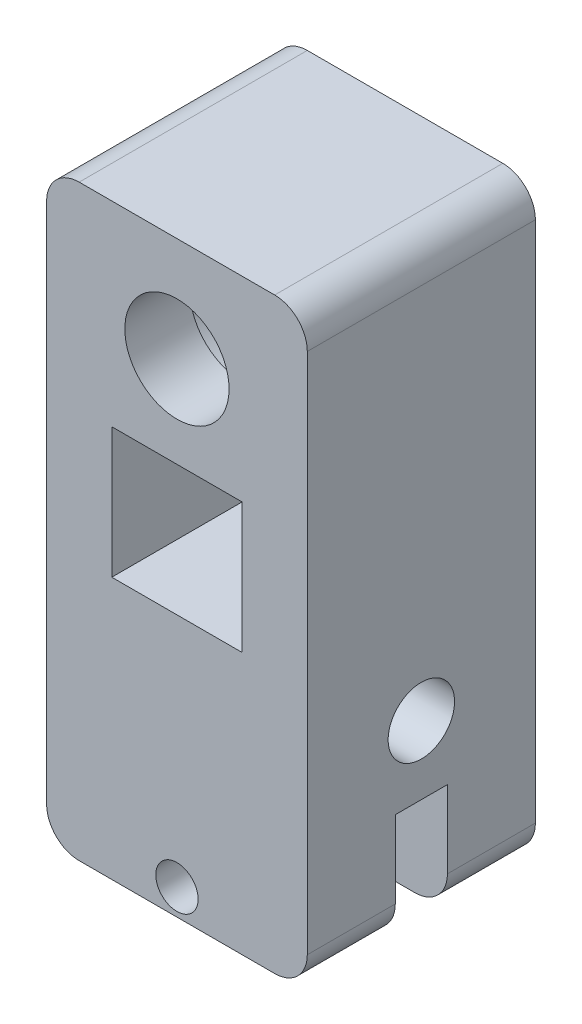
ISO-10303-21;
HEADER;
FILE_DESCRIPTION(('STEP AP214'),'2;1');
FILE_NAME('part.step','',(''),(''),'','','');
FILE_SCHEMA(('AUTOMOTIVE_DESIGN { 1 0 10303 214 1 1 1 1 }'));
ENDSEC;
DATA;
#1=APPLICATION_CONTEXT('core data for automotive mechanical design processes');
#2=APPLICATION_PROTOCOL_DEFINITION('international standard','automotive_design',2000,#1);
#3=PRODUCT_CONTEXT('',#1,'mechanical');
#4=PRODUCT('Part','Part','',(#3));
#5=PRODUCT_RELATED_PRODUCT_CATEGORY('part','',(#4));
#6=PRODUCT_DEFINITION_FORMATION('','',#4);
#7=PRODUCT_DEFINITION_CONTEXT('part definition',#1,'design');
#8=PRODUCT_DEFINITION('design','',#6,#7);
#9=PRODUCT_DEFINITION_SHAPE('','',#8);
#10=(LENGTH_UNIT() NAMED_UNIT(*) SI_UNIT(.MILLI.,.METRE.));
#11=(NAMED_UNIT(*) PLANE_ANGLE_UNIT() SI_UNIT($,.RADIAN.));
#12=(NAMED_UNIT(*) SI_UNIT($,.STERADIAN.) SOLID_ANGLE_UNIT());
#13=UNCERTAINTY_MEASURE_WITH_UNIT(LENGTH_MEASURE(1.E-05),#10,'distance_accuracy_value','');
#14=(GEOMETRIC_REPRESENTATION_CONTEXT(3) GLOBAL_UNCERTAINTY_ASSIGNED_CONTEXT((#13)) GLOBAL_UNIT_ASSIGNED_CONTEXT((#10,
#11,#12)) REPRESENTATION_CONTEXT('',''));
#15=CARTESIAN_POINT('',(0.,0.,0.));
#16=DIRECTION('',(0.,0.,1.));
#17=DIRECTION('',(1.,0.,0.));
#18=AXIS2_PLACEMENT_3D('',#15,#16,#17);
#19=CARTESIAN_POINT('',(5.,5.,35.));
#20=DIRECTION('',(0.,0.,-1.));
#21=DIRECTION('',(-1.,0.,0.));
#22=AXIS2_PLACEMENT_3D('',#19,#20,#21);
#23=CYLINDRICAL_SURFACE('',#22,5.);
#24=CARTESIAN_POINT('',(5.,5.,21.5));
#25=DIRECTION('',(0.,0.,1.));
#26=DIRECTION('',(1.,0.,0.));
#27=AXIS2_PLACEMENT_3D('',#24,#25,#26);
#28=CIRCLE('',#27,5.);
#29=CARTESIAN_POINT('',(5.00000000000004,0.,21.5));
#30=VERTEX_POINT('',#29);
#31=CARTESIAN_POINT('',(0.,5.,21.5));
#32=VERTEX_POINT('',#31);
#33=EDGE_CURVE('E283',#30,#32,#28,.F.);
#34=ORIENTED_EDGE('',*,*,#33,.F.);
#35=DIRECTION('',(0.,0.,-1.));
#36=VECTOR('',#35,1.);
#37=CARTESIAN_POINT('',(5.00000000000004,0.,35.));
#38=LINE('',#37,#36);
#39=CARTESIAN_POINT('',(5.00000000000004,0.,35.));
#40=VERTEX_POINT('',#39);
#41=EDGE_CURVE('E230',#40,#30,#38,.T.);
#42=ORIENTED_EDGE('',*,*,#41,.F.);
#43=CARTESIAN_POINT('',(5.,5.,35.));
#44=DIRECTION('',(0.,0.,1.));
#45=DIRECTION('',(1.,0.,0.));
#46=AXIS2_PLACEMENT_3D('',#43,#44,#45);
#47=CIRCLE('',#46,5.);
#48=CARTESIAN_POINT('',(0.,5.00000000000004,35.));
#49=VERTEX_POINT('',#48);
#50=EDGE_CURVE('E306',#40,#49,#47,.F.);
#51=ORIENTED_EDGE('',*,*,#50,.T.);
#52=DIRECTION('',(0.,0.,-1.));
#53=VECTOR('',#52,1.);
#54=CARTESIAN_POINT('',(0.,5.00000000000004,35.));
#55=LINE('',#54,#53);
#56=EDGE_CURVE('E48',#49,#32,#55,.T.);
#57=ORIENTED_EDGE('',*,*,#56,.T.);
#58=EDGE_LOOP('',(#34,#42,#51,#57));
#59=FACE_BOUND('',#58,.T.);
#60=ADVANCED_FACE('F39',(#59),#23,.T.);
#61=CARTESIAN_POINT('',(0.,0.,35.));
#62=DIRECTION('',(0.,1.,0.));
#63=DIRECTION('',(0.,0.,1.));
#64=AXIS2_PLACEMENT_3D('',#61,#62,#63);
#65=PLANE('',#64);
#66=ORIENTED_EDGE('',*,*,#41,.T.);
#67=DIRECTION('',(-1.,0.,0.));
#68=VECTOR('',#67,1.);
#69=CARTESIAN_POINT('',(40.,0.,21.5));
#70=LINE('',#69,#68);
#71=CARTESIAN_POINT('',(35.,0.,21.5));
#72=VERTEX_POINT('',#71);
#73=EDGE_CURVE('E245',#72,#30,#70,.T.);
#74=ORIENTED_EDGE('',*,*,#73,.F.);
#75=DIRECTION('',(0.,0.,-1.));
#76=VECTOR('',#75,1.);
#77=CARTESIAN_POINT('',(35.,0.,35.));
#78=LINE('',#77,#76);
#79=CARTESIAN_POINT('',(35.,0.,35.));
#80=VERTEX_POINT('',#79);
#81=EDGE_CURVE('E226',#80,#72,#78,.T.);
#82=ORIENTED_EDGE('',*,*,#81,.F.);
#83=DIRECTION('',(1.,0.,0.));
#84=VECTOR('',#83,1.);
#85=CARTESIAN_POINT('',(0.,0.,35.));
#86=LINE('',#85,#84);
#87=EDGE_CURVE('E309',#40,#80,#86,.T.);
#88=ORIENTED_EDGE('',*,*,#87,.F.);
#89=EDGE_LOOP('',(#66,#74,#82,#88));
#90=FACE_BOUND('',#89,.T.);
#91=ADVANCED_FACE('F315',(#90),#65,.F.);
#92=CARTESIAN_POINT('',(35.,5.,35.));
#93=DIRECTION('',(0.,0.,-1.));
#94=DIRECTION('',(-1.,0.,0.));
#95=AXIS2_PLACEMENT_3D('',#92,#93,#94);
#96=CYLINDRICAL_SURFACE('',#95,5.);
#97=ORIENTED_EDGE('',*,*,#81,.T.);
#98=CARTESIAN_POINT('',(35.,5.,21.5));
#99=DIRECTION('',(0.,0.,1.));
#100=DIRECTION('',(1.,0.,0.));
#101=AXIS2_PLACEMENT_3D('',#98,#99,#100);
#102=CIRCLE('',#101,5.);
#103=CARTESIAN_POINT('',(40.,5.00000000000004,21.5));
#104=VERTEX_POINT('',#103);
#105=EDGE_CURVE('E280',#72,#104,#102,.T.);
#106=ORIENTED_EDGE('',*,*,#105,.T.);
#107=DIRECTION('',(0.,0.,-1.));
#108=VECTOR('',#107,1.);
#109=CARTESIAN_POINT('',(40.,5.00000000000004,35.));
#110=LINE('',#109,#108);
#111=CARTESIAN_POINT('',(40.,5.00000000000004,35.));
#112=VERTEX_POINT('',#111);
#113=EDGE_CURVE('E223',#112,#104,#110,.T.);
#114=ORIENTED_EDGE('',*,*,#113,.F.);
#115=CARTESIAN_POINT('',(35.,5.,35.));
#116=DIRECTION('',(0.,0.,1.));
#117=DIRECTION('',(1.,0.,0.));
#118=AXIS2_PLACEMENT_3D('',#115,#116,#117);
#119=CIRCLE('',#118,5.);
#120=EDGE_CURVE('E155',#80,#112,#119,.T.);
#121=ORIENTED_EDGE('',*,*,#120,.F.);
#122=EDGE_LOOP('',(#97,#106,#114,#121));
#123=FACE_BOUND('',#122,.T.);
#124=ADVANCED_FACE('F318',(#123),#96,.T.);
#125=CARTESIAN_POINT('',(20.,4.,35.));
#126=DIRECTION('',(0.,0.,-1.));
#127=DIRECTION('',(-1.,0.,0.));
#128=AXIS2_PLACEMENT_3D('',#125,#126,#127);
#129=CYLINDRICAL_SURFACE('',#128,3.25);
#130=CARTESIAN_POINT('',(20.,4.,21.5));
#131=DIRECTION('',(0.,0.,1.));
#132=DIRECTION('',(1.,0.,0.));
#133=AXIS2_PLACEMENT_3D('',#130,#131,#132);
#134=CIRCLE('',#133,3.25);
#135=CARTESIAN_POINT('',(23.25,4.,21.5));
#136=VERTEX_POINT('',#135);
#137=EDGE_CURVE('E43',#136,#136,#134,.T.);
#138=ORIENTED_EDGE('',*,*,#137,.F.);
#139=EDGE_LOOP('',(#138));
#140=FACE_BOUND('',#139,.T.);
#141=CARTESIAN_POINT('',(20.,4.,35.));
#142=DIRECTION('',(0.,0.,1.));
#143=DIRECTION('',(1.,0.,0.));
#144=AXIS2_PLACEMENT_3D('',#141,#142,#143);
#145=CIRCLE('',#144,3.25);
#146=CARTESIAN_POINT('',(23.25,4.,35.));
#147=VERTEX_POINT('',#146);
#148=EDGE_CURVE('E175',#147,#147,#145,.T.);
#149=ORIENTED_EDGE('',*,*,#148,.T.);
#150=EDGE_LOOP('',(#149));
#151=FACE_BOUND('',#150,.T.);
#152=ADVANCED_FACE('F390',(#140,#151),#129,.F.);
#153=CARTESIAN_POINT('',(20.,74.17,35.));
#154=DIRECTION('',(0.,0.,-1.));
#155=DIRECTION('',(-1.,0.,0.));
#156=AXIS2_PLACEMENT_3D('',#153,#154,#155);
#157=CYLINDRICAL_SURFACE('',#156,12.);
#158=CARTESIAN_POINT('',(20.,74.17,0.));
#159=DIRECTION('',(0.,0.,1.));
#160=DIRECTION('',(1.,0.,0.));
#161=AXIS2_PLACEMENT_3D('',#158,#159,#160);
#162=CIRCLE('',#161,12.);
#163=CARTESIAN_POINT('',(32.,74.17,0.));
#164=VERTEX_POINT('',#163);
#165=EDGE_CURVE('E214',#164,#164,#162,.T.);
#166=ORIENTED_EDGE('',*,*,#165,.F.);
#167=EDGE_LOOP('',(#166));
#168=FACE_BOUND('',#167,.T.);
#169=CARTESIAN_POINT('',(20.,74.17,25.));
#170=DIRECTION('',(0.,0.,1.));
#171=DIRECTION('',(1.,0.,0.));
#172=AXIS2_PLACEMENT_3D('',#169,#170,#171);
#173=CIRCLE('',#172,12.);
#174=CARTESIAN_POINT('',(32.,74.17,25.));
#175=VERTEX_POINT('',#174);
#176=EDGE_CURVE('E186',#175,#175,#173,.T.);
#177=ORIENTED_EDGE('',*,*,#176,.T.);
#178=EDGE_LOOP('',(#177));
#179=FACE_BOUND('',#178,.T.);
#180=ADVANCED_FACE('F406',(#168,#179),#157,.F.);
#181=CARTESIAN_POINT('',(5.,85.17,35.));
#182=DIRECTION('',(0.,0.,-1.));
#183=DIRECTION('',(-1.,0.,0.));
#184=AXIS2_PLACEMENT_3D('',#181,#182,#183);
#185=CYLINDRICAL_SURFACE('',#184,5.);
#186=CARTESIAN_POINT('',(5.,85.17,0.));
#187=DIRECTION('',(0.,0.,1.));
#188=DIRECTION('',(1.,0.,0.));
#189=AXIS2_PLACEMENT_3D('',#186,#187,#188);
#190=CIRCLE('',#189,5.);
#191=CARTESIAN_POINT('',(0.,85.17,0.));
#192=VERTEX_POINT('',#191);
#193=CARTESIAN_POINT('',(5.,90.17,0.));
#194=VERTEX_POINT('',#193);
#195=EDGE_CURVE('E194',#192,#194,#190,.F.);
#196=ORIENTED_EDGE('',*,*,#195,.F.);
#197=DIRECTION('',(0.,0.,-1.));
#198=VECTOR('',#197,1.);
#199=CARTESIAN_POINT('',(0.,85.17,35.));
#200=LINE('',#199,#198);
#201=CARTESIAN_POINT('',(0.,85.17,35.));
#202=VERTEX_POINT('',#201);
#203=EDGE_CURVE('E11',#202,#192,#200,.T.);
#204=ORIENTED_EDGE('',*,*,#203,.F.);
#205=CARTESIAN_POINT('',(5.,85.17,35.));
#206=DIRECTION('',(0.,0.,1.));
#207=DIRECTION('',(1.,0.,0.));
#208=AXIS2_PLACEMENT_3D('',#205,#206,#207);
#209=CIRCLE('',#208,5.);
#210=CARTESIAN_POINT('',(5.,90.17,35.));
#211=VERTEX_POINT('',#210);
#212=EDGE_CURVE('E301',#202,#211,#209,.F.);
#213=ORIENTED_EDGE('',*,*,#212,.T.);
#214=DIRECTION('',(0.,0.,-1.));
#215=VECTOR('',#214,1.);
#216=CARTESIAN_POINT('',(5.,90.17,35.));
#217=LINE('',#216,#215);
#218=EDGE_CURVE('E65',#211,#194,#217,.T.);
#219=ORIENTED_EDGE('',*,*,#218,.T.);
#220=EDGE_LOOP('',(#196,#204,#213,#219));
#221=FACE_BOUND('',#220,.T.);
#222=ADVANCED_FACE('F402',(#221),#185,.T.);
#223=CARTESIAN_POINT('',(0.,0.,35.));
#224=DIRECTION('',(-1.,0.,0.));
#225=DIRECTION('',(0.,0.,1.));
#226=AXIS2_PLACEMENT_3D('',#223,#224,#225);
#227=PLANE('',#226);
#228=DIRECTION('',(0.,1.,0.));
#229=VECTOR('',#228,1.);
#230=CARTESIAN_POINT('',(0.,0.,21.5));
#231=LINE('',#230,#229);
#232=CARTESIAN_POINT('',(0.,16.86,21.5));
#233=VERTEX_POINT('',#232);
#234=EDGE_CURVE('E274',#32,#233,#231,.T.);
#235=ORIENTED_EDGE('',*,*,#234,.F.);
#236=ORIENTED_EDGE('',*,*,#56,.F.);
#237=DIRECTION('',(0.,1.,0.));
#238=VECTOR('',#237,1.);
#239=CARTESIAN_POINT('',(0.,0.,35.));
#240=LINE('',#239,#238);
#241=EDGE_CURVE('E303',#49,#202,#240,.T.);
#242=ORIENTED_EDGE('',*,*,#241,.T.);
#243=ORIENTED_EDGE('',*,*,#203,.T.);
#244=DIRECTION('',(0.,1.,0.));
#245=VECTOR('',#244,1.);
#246=CARTESIAN_POINT('',(0.,0.,0.));
#247=LINE('',#246,#245);
#248=CARTESIAN_POINT('',(0.,5.00000000000004,0.));
#249=VERTEX_POINT('',#248);
#250=EDGE_CURVE('E196',#249,#192,#247,.T.);
#251=ORIENTED_EDGE('',*,*,#250,.F.);
#252=CARTESIAN_POINT('',(0.,5.,13.5));
#253=VERTEX_POINT('',#252);
#254=EDGE_CURVE('E233',#253,#249,#55,.T.);
#255=ORIENTED_EDGE('',*,*,#254,.F.);
#256=DIRECTION('',(0.,-1.,0.));
#257=VECTOR('',#256,1.);
#258=CARTESIAN_POINT('',(0.,0.,13.5));
#259=LINE('',#258,#257);
#260=CARTESIAN_POINT('',(0.,16.86,13.5));
#261=VERTEX_POINT('',#260);
#262=EDGE_CURVE('E264',#261,#253,#259,.T.);
#263=ORIENTED_EDGE('',*,*,#262,.F.);
#264=DIRECTION('',(0.,0.,-1.));
#265=VECTOR('',#264,1.);
#266=CARTESIAN_POINT('',(0.,16.86,13.5));
#267=LINE('',#266,#265);
#268=EDGE_CURVE('E355',#233,#261,#267,.T.);
#269=ORIENTED_EDGE('',*,*,#268,.F.);
#270=EDGE_LOOP('',(#235,#236,#242,#243,#251,#255,#263,#269));
#271=FACE_BOUND('',#270,.T.);
#272=CARTESIAN_POINT('',(0.,27.36,17.5));
#273=DIRECTION('',(-1.,0.,0.));
#274=DIRECTION('',(0.,0.,1.));
#275=AXIS2_PLACEMENT_3D('',#272,#273,#274);
#276=CIRCLE('',#275,5.1);
#277=CARTESIAN_POINT('',(0.,27.36,22.6));
#278=VERTEX_POINT('',#277);
#279=EDGE_CURVE('E275',#278,#278,#276,.T.);
#280=ORIENTED_EDGE('',*,*,#279,.F.);
#281=EDGE_LOOP('',(#280));
#282=FACE_BOUND('',#281,.T.);
#283=ADVANCED_FACE('F361',(#271,#282),#227,.T.);
#284=CARTESIAN_POINT('',(5.,5.,13.5));
#285=DIRECTION('',(0.,0.,-1.));
#286=DIRECTION('',(0.,1.,0.));
#287=AXIS2_PLACEMENT_3D('',#284,#285,#286);
#288=CIRCLE('',#287,5.);
#289=CARTESIAN_POINT('',(5.00000000000004,0.,13.5));
#290=VERTEX_POINT('',#289);
#291=EDGE_CURVE('E249',#253,#290,#288,.F.);
#292=ORIENTED_EDGE('',*,*,#291,.F.);
#293=ORIENTED_EDGE('',*,*,#254,.T.);
#294=CARTESIAN_POINT('',(5.,5.,0.));
#295=DIRECTION('',(0.,0.,1.));
#296=DIRECTION('',(1.,0.,0.));
#297=AXIS2_PLACEMENT_3D('',#294,#295,#296);
#298=CIRCLE('',#297,5.);
#299=CARTESIAN_POINT('',(5.00000000000004,0.,0.));
#300=VERTEX_POINT('',#299);
#301=EDGE_CURVE('E199',#300,#249,#298,.F.);
#302=ORIENTED_EDGE('',*,*,#301,.F.);
#303=EDGE_CURVE('E229',#290,#300,#38,.T.);
#304=ORIENTED_EDGE('',*,*,#303,.F.);
#305=EDGE_LOOP('',(#292,#293,#302,#304));
#306=FACE_BOUND('',#305,.T.);
#307=ADVANCED_FACE('F368',(#306),#23,.T.);
#308=CARTESIAN_POINT('',(35.,0.,13.5));
#309=VERTEX_POINT('',#308);
#310=CARTESIAN_POINT('',(35.,0.,0.));
#311=VERTEX_POINT('',#310);
#312=EDGE_CURVE('E225',#309,#311,#78,.T.);
#313=ORIENTED_EDGE('',*,*,#312,.F.);
#314=DIRECTION('',(-1.,0.,0.));
#315=VECTOR('',#314,1.);
#316=CARTESIAN_POINT('',(40.,0.,13.5));
#317=LINE('',#316,#315);
#318=EDGE_CURVE('E252',#309,#290,#317,.T.);
#319=ORIENTED_EDGE('',*,*,#318,.T.);
#320=ORIENTED_EDGE('',*,*,#303,.T.);
#321=DIRECTION('',(1.,0.,0.));
#322=VECTOR('',#321,1.);
#323=CARTESIAN_POINT('',(0.,0.,0.));
#324=LINE('',#323,#322);
#325=EDGE_CURVE('E202',#300,#311,#324,.T.);
#326=ORIENTED_EDGE('',*,*,#325,.T.);
#327=EDGE_LOOP('',(#313,#319,#320,#326));
#328=FACE_BOUND('',#327,.T.);
#329=ADVANCED_FACE('F373',(#328),#65,.F.);
#330=CARTESIAN_POINT('',(40.,5.00000000000004,13.5));
#331=VERTEX_POINT('',#330);
#332=CARTESIAN_POINT('',(40.,5.00000000000004,0.));
#333=VERTEX_POINT('',#332);
#334=EDGE_CURVE('E169',#331,#333,#110,.T.);
#335=ORIENTED_EDGE('',*,*,#334,.F.);
#336=CARTESIAN_POINT('',(35.,5.,13.5));
#337=DIRECTION('',(0.,0.,-1.));
#338=DIRECTION('',(0.,1.,0.));
#339=AXIS2_PLACEMENT_3D('',#336,#337,#338);
#340=CIRCLE('',#339,5.);
#341=EDGE_CURVE('E244',#331,#309,#340,.T.);
#342=ORIENTED_EDGE('',*,*,#341,.T.);
#343=ORIENTED_EDGE('',*,*,#312,.T.);
#344=CARTESIAN_POINT('',(35.,5.,0.));
#345=DIRECTION('',(0.,0.,1.));
#346=DIRECTION('',(1.,0.,0.));
#347=AXIS2_PLACEMENT_3D('',#344,#345,#346);
#348=CIRCLE('',#347,5.);
#349=EDGE_CURVE('E205',#311,#333,#348,.T.);
#350=ORIENTED_EDGE('',*,*,#349,.T.);
#351=EDGE_LOOP('',(#335,#342,#343,#350));
#352=FACE_BOUND('',#351,.T.);
#353=ADVANCED_FACE('F380',(#352),#96,.T.);
#354=CARTESIAN_POINT('',(40.,0.,35.));
#355=DIRECTION('',(-1.,0.,0.));
#356=DIRECTION('',(0.,0.,1.));
#357=AXIS2_PLACEMENT_3D('',#354,#355,#356);
#358=PLANE('',#357);
#359=ORIENTED_EDGE('',*,*,#113,.T.);
#360=DIRECTION('',(0.,1.,0.));
#361=VECTOR('',#360,1.);
#362=CARTESIAN_POINT('',(40.,0.,21.5));
#363=LINE('',#362,#361);
#364=CARTESIAN_POINT('',(40.,16.86,21.5));
#365=VERTEX_POINT('',#364);
#366=EDGE_CURVE('E345',#104,#365,#363,.T.);
#367=ORIENTED_EDGE('',*,*,#366,.T.);
#368=DIRECTION('',(0.,0.,-1.));
#369=VECTOR('',#368,1.);
#370=CARTESIAN_POINT('',(40.,16.86,13.5));
#371=LINE('',#370,#369);
#372=CARTESIAN_POINT('',(40.,16.86,13.5));
#373=VERTEX_POINT('',#372);
#374=EDGE_CURVE('E351',#365,#373,#371,.T.);
#375=ORIENTED_EDGE('',*,*,#374,.T.);
#376=DIRECTION('',(0.,-1.,0.));
#377=VECTOR('',#376,1.);
#378=CARTESIAN_POINT('',(40.,0.,13.5));
#379=LINE('',#378,#377);
#380=EDGE_CURVE('E56',#373,#331,#379,.T.);
#381=ORIENTED_EDGE('',*,*,#380,.T.);
#382=ORIENTED_EDGE('',*,*,#334,.T.);
#383=DIRECTION('',(0.,1.,0.));
#384=VECTOR('',#383,1.);
#385=CARTESIAN_POINT('',(40.,0.,0.));
#386=LINE('',#385,#384);
#387=CARTESIAN_POINT('',(40.,85.17,0.));
#388=VERTEX_POINT('',#387);
#389=EDGE_CURVE('E165',#333,#388,#386,.T.);
#390=ORIENTED_EDGE('',*,*,#389,.T.);
#391=DIRECTION('',(0.,0.,-1.));
#392=VECTOR('',#391,1.);
#393=CARTESIAN_POINT('',(40.,85.17,35.));
#394=LINE('',#393,#392);
#395=CARTESIAN_POINT('',(40.,85.17,35.));
#396=VERTEX_POINT('',#395);
#397=EDGE_CURVE('E161',#396,#388,#394,.T.);
#398=ORIENTED_EDGE('',*,*,#397,.F.);
#399=DIRECTION('',(0.,1.,0.));
#400=VECTOR('',#399,1.);
#401=CARTESIAN_POINT('',(40.,0.,35.));
#402=LINE('',#401,#400);
#403=EDGE_CURVE('E146',#112,#396,#402,.T.);
#404=ORIENTED_EDGE('',*,*,#403,.F.);
#405=EDGE_LOOP('',(#359,#367,#375,#381,#382,#390,#398,#404));
#406=FACE_BOUND('',#405,.T.);
#407=CARTESIAN_POINT('',(40.,27.36,17.5));
#408=DIRECTION('',(-1.,0.,0.));
#409=DIRECTION('',(0.,0.,1.));
#410=AXIS2_PLACEMENT_3D('',#407,#408,#409);
#411=CIRCLE('',#410,5.1);
#412=CARTESIAN_POINT('',(40.,27.36,22.6));
#413=VERTEX_POINT('',#412);
#414=EDGE_CURVE('E271',#413,#413,#411,.T.);
#415=ORIENTED_EDGE('',*,*,#414,.T.);
#416=EDGE_LOOP('',(#415));
#417=FACE_BOUND('',#416,.T.);
#418=ADVANCED_FACE('F162',(#406,#417),#358,.F.);
#419=CARTESIAN_POINT('',(35.,85.17,35.));
#420=DIRECTION('',(0.,0.,-1.));
#421=DIRECTION('',(-1.,0.,0.));
#422=AXIS2_PLACEMENT_3D('',#419,#420,#421);
#423=CYLINDRICAL_SURFACE('',#422,5.);
#424=CARTESIAN_POINT('',(35.,85.17,0.));
#425=DIRECTION('',(0.,0.,1.));
#426=DIRECTION('',(1.,0.,0.));
#427=AXIS2_PLACEMENT_3D('',#424,#425,#426);
#428=CIRCLE('',#427,5.);
#429=CARTESIAN_POINT('',(35.,90.17,0.));
#430=VERTEX_POINT('',#429);
#431=EDGE_CURVE('E209',#430,#388,#428,.F.);
#432=ORIENTED_EDGE('',*,*,#431,.F.);
#433=DIRECTION('',(0.,0.,-1.));
#434=VECTOR('',#433,1.);
#435=CARTESIAN_POINT('',(35.,90.17,35.));
#436=LINE('',#435,#434);
#437=CARTESIAN_POINT('',(35.,90.17,35.));
#438=VERTEX_POINT('',#437);
#439=EDGE_CURVE('E170',#438,#430,#436,.T.);
#440=ORIENTED_EDGE('',*,*,#439,.F.);
#441=CARTESIAN_POINT('',(35.,85.17,35.));
#442=DIRECTION('',(0.,0.,1.));
#443=DIRECTION('',(1.,0.,0.));
#444=AXIS2_PLACEMENT_3D('',#441,#442,#443);
#445=CIRCLE('',#444,5.);
#446=EDGE_CURVE('E153',#438,#396,#445,.F.);
#447=ORIENTED_EDGE('',*,*,#446,.T.);
#448=ORIENTED_EDGE('',*,*,#397,.T.);
#449=EDGE_LOOP('',(#432,#440,#447,#448));
#450=FACE_BOUND('',#449,.T.);
#451=ADVANCED_FACE('F172',(#450),#423,.T.);
#452=CARTESIAN_POINT('',(0.,40.17,35.));
#453=DIRECTION('',(0.,1.,0.));
#454=DIRECTION('',(0.,0.,1.));
#455=AXIS2_PLACEMENT_3D('',#452,#453,#454);
#456=PLANE('',#455);
#457=DIRECTION('',(1.,0.,0.));
#458=VECTOR('',#457,1.);
#459=CARTESIAN_POINT('',(0.,40.17,0.));
#460=LINE('',#459,#458);
#461=CARTESIAN_POINT('',(10.,40.17,0.));
#462=VERTEX_POINT('',#461);
#463=CARTESIAN_POINT('',(30.,40.17,0.));
#464=VERTEX_POINT('',#463);
#465=EDGE_CURVE('E182',#462,#464,#460,.T.);
#466=ORIENTED_EDGE('',*,*,#465,.F.);
#467=DIRECTION('',(0.,0.,-1.));
#468=VECTOR('',#467,1.);
#469=CARTESIAN_POINT('',(10.,40.17,35.));
#470=LINE('',#469,#468);
#471=CARTESIAN_POINT('',(10.,40.17,35.));
#472=VERTEX_POINT('',#471);
#473=EDGE_CURVE('E115',#472,#462,#470,.T.);
#474=ORIENTED_EDGE('',*,*,#473,.F.);
#475=DIRECTION('',(1.,0.,0.));
#476=VECTOR('',#475,1.);
#477=CARTESIAN_POINT('',(0.,40.17,35.));
#478=LINE('',#477,#476);
#479=CARTESIAN_POINT('',(30.,40.17,35.));
#480=VERTEX_POINT('',#479);
#481=EDGE_CURVE('E220',#472,#480,#478,.T.);
#482=ORIENTED_EDGE('',*,*,#481,.T.);
#483=DIRECTION('',(0.,0.,-1.));
#484=VECTOR('',#483,1.);
#485=CARTESIAN_POINT('',(30.,40.17,35.));
#486=LINE('',#485,#484);
#487=EDGE_CURVE('E181',#480,#464,#486,.T.);
#488=ORIENTED_EDGE('',*,*,#487,.T.);
#489=EDGE_LOOP('',(#466,#474,#482,#488));
#490=FACE_BOUND('',#489,.T.);
#491=ADVANCED_FACE('F41',(#490),#456,.T.);
#492=CARTESIAN_POINT('',(10.,0.,35.));
#493=DIRECTION('',(1.,0.,0.));
#494=DIRECTION('',(0.,1.,0.));
#495=AXIS2_PLACEMENT_3D('',#492,#493,#494);
#496=PLANE('',#495);
#497=DIRECTION('',(0.,-1.,0.));
#498=VECTOR('',#497,1.);
#499=CARTESIAN_POINT('',(10.,0.,0.));
#500=LINE('',#499,#498);
#501=CARTESIAN_POINT('',(10.,60.17,0.));
#502=VERTEX_POINT('',#501);
#503=EDGE_CURVE('E185',#502,#462,#500,.T.);
#504=ORIENTED_EDGE('',*,*,#503,.F.);
#505=DIRECTION('',(0.,0.,-1.));
#506=VECTOR('',#505,1.);
#507=CARTESIAN_POINT('',(10.,60.17,35.));
#508=LINE('',#507,#506);
#509=CARTESIAN_POINT('',(10.,60.17,35.));
#510=VERTEX_POINT('',#509);
#511=EDGE_CURVE('E240',#510,#502,#508,.T.);
#512=ORIENTED_EDGE('',*,*,#511,.F.);
#513=DIRECTION('',(0.,-1.,0.));
#514=VECTOR('',#513,1.);
#515=CARTESIAN_POINT('',(10.,0.,35.));
#516=LINE('',#515,#514);
#517=EDGE_CURVE('E294',#510,#472,#516,.T.);
#518=ORIENTED_EDGE('',*,*,#517,.T.);
#519=ORIENTED_EDGE('',*,*,#473,.T.);
#520=EDGE_LOOP('',(#504,#512,#518,#519));
#521=FACE_BOUND('',#520,.T.);
#522=ADVANCED_FACE('F417',(#521),#496,.T.);
#523=CARTESIAN_POINT('',(0.,60.17,35.));
#524=DIRECTION('',(0.,1.,0.));
#525=DIRECTION('',(0.,0.,1.));
#526=AXIS2_PLACEMENT_3D('',#523,#524,#525);
#527=PLANE('',#526);
#528=DIRECTION('',(1.,0.,0.));
#529=VECTOR('',#528,1.);
#530=CARTESIAN_POINT('',(0.,60.17,0.));
#531=LINE('',#530,#529);
#532=CARTESIAN_POINT('',(30.,60.17,0.));
#533=VERTEX_POINT('',#532);
#534=EDGE_CURVE('E189',#502,#533,#531,.T.);
#535=ORIENTED_EDGE('',*,*,#534,.T.);
#536=DIRECTION('',(0.,0.,-1.));
#537=VECTOR('',#536,1.);
#538=CARTESIAN_POINT('',(30.,60.17,35.));
#539=LINE('',#538,#537);
#540=CARTESIAN_POINT('',(30.,60.17,35.));
#541=VERTEX_POINT('',#540);
#542=EDGE_CURVE('E237',#541,#533,#539,.T.);
#543=ORIENTED_EDGE('',*,*,#542,.F.);
#544=DIRECTION('',(1.,0.,0.));
#545=VECTOR('',#544,1.);
#546=CARTESIAN_POINT('',(0.,60.17,35.));
#547=LINE('',#546,#545);
#548=EDGE_CURVE('E297',#510,#541,#547,.T.);
#549=ORIENTED_EDGE('',*,*,#548,.F.);
#550=ORIENTED_EDGE('',*,*,#511,.T.);
#551=EDGE_LOOP('',(#535,#543,#549,#550));
#552=FACE_BOUND('',#551,.T.);
#553=ADVANCED_FACE('F415',(#552),#527,.F.);
#554=CARTESIAN_POINT('',(0.,90.17,35.));
#555=DIRECTION('',(0.,1.,0.));
#556=DIRECTION('',(0.,0.,1.));
#557=AXIS2_PLACEMENT_3D('',#554,#555,#556);
#558=PLANE('',#557);
#559=DIRECTION('',(1.,0.,0.));
#560=VECTOR('',#559,1.);
#561=CARTESIAN_POINT('',(0.,90.17,0.));
#562=LINE('',#561,#560);
#563=EDGE_CURVE('E211',#194,#430,#562,.T.);
#564=ORIENTED_EDGE('',*,*,#563,.F.);
#565=ORIENTED_EDGE('',*,*,#218,.F.);
#566=DIRECTION('',(1.,0.,0.));
#567=VECTOR('',#566,1.);
#568=CARTESIAN_POINT('',(0.,90.17,35.));
#569=LINE('',#568,#567);
#570=EDGE_CURVE('E173',#211,#438,#569,.T.);
#571=ORIENTED_EDGE('',*,*,#570,.T.);
#572=ORIENTED_EDGE('',*,*,#439,.T.);
#573=EDGE_LOOP('',(#564,#565,#571,#572));
#574=FACE_BOUND('',#573,.T.);
#575=ADVANCED_FACE('F413',(#574),#558,.T.);
#576=CARTESIAN_POINT('',(30.,0.,35.));
#577=DIRECTION('',(1.,0.,0.));
#578=DIRECTION('',(0.,1.,0.));
#579=AXIS2_PLACEMENT_3D('',#576,#577,#578);
#580=PLANE('',#579);
#581=DIRECTION('',(0.,-1.,0.));
#582=VECTOR('',#581,1.);
#583=CARTESIAN_POINT('',(30.,0.,0.));
#584=LINE('',#583,#582);
#585=EDGE_CURVE('E191',#533,#464,#584,.T.);
#586=ORIENTED_EDGE('',*,*,#585,.T.);
#587=ORIENTED_EDGE('',*,*,#487,.F.);
#588=DIRECTION('',(0.,-1.,0.));
#589=VECTOR('',#588,1.);
#590=CARTESIAN_POINT('',(30.,0.,35.));
#591=LINE('',#590,#589);
#592=EDGE_CURVE('E299',#541,#480,#591,.T.);
#593=ORIENTED_EDGE('',*,*,#592,.F.);
#594=ORIENTED_EDGE('',*,*,#542,.T.);
#595=EDGE_LOOP('',(#586,#587,#593,#594));
#596=FACE_BOUND('',#595,.T.);
#597=ADVANCED_FACE('F409',(#596),#580,.F.);
#598=CARTESIAN_POINT('',(20.,4.,13.5));
#599=DIRECTION('',(0.,0.,-1.));
#600=DIRECTION('',(0.,1.,0.));
#601=AXIS2_PLACEMENT_3D('',#598,#599,#600);
#602=CIRCLE('',#601,3.25);
#603=CARTESIAN_POINT('',(20.,7.25,13.5));
#604=VERTEX_POINT('',#603);
#605=EDGE_CURVE('E242',#604,#604,#602,.T.);
#606=ORIENTED_EDGE('',*,*,#605,.F.);
#607=EDGE_LOOP('',(#606));
#608=FACE_BOUND('',#607,.T.);
#609=CARTESIAN_POINT('',(20.,4.,0.));
#610=DIRECTION('',(0.,0.,1.));
#611=DIRECTION('',(1.,0.,0.));
#612=AXIS2_PLACEMENT_3D('',#609,#610,#611);
#613=CIRCLE('',#612,3.25);
#614=CARTESIAN_POINT('',(23.25,4.,0.));
#615=VERTEX_POINT('',#614);
#616=EDGE_CURVE('E217',#615,#615,#613,.T.);
#617=ORIENTED_EDGE('',*,*,#616,.F.);
#618=EDGE_LOOP('',(#617));
#619=FACE_BOUND('',#618,.T.);
#620=ADVANCED_FACE('F412',(#608,#619),#129,.F.);
#621=CARTESIAN_POINT('',(0.,0.,35.));
#622=DIRECTION('',(0.,0.,1.));
#623=DIRECTION('',(1.,0.,0.));
#624=AXIS2_PLACEMENT_3D('',#621,#622,#623);
#625=PLANE('',#624);
#626=ORIENTED_EDGE('',*,*,#481,.F.);
#627=ORIENTED_EDGE('',*,*,#517,.F.);
#628=ORIENTED_EDGE('',*,*,#548,.T.);
#629=ORIENTED_EDGE('',*,*,#592,.T.);
#630=EDGE_LOOP('',(#626,#627,#628,#629));
#631=FACE_BOUND('',#630,.T.);
#632=ORIENTED_EDGE('',*,*,#212,.F.);
#633=ORIENTED_EDGE('',*,*,#241,.F.);
#634=ORIENTED_EDGE('',*,*,#50,.F.);
#635=ORIENTED_EDGE('',*,*,#87,.T.);
#636=ORIENTED_EDGE('',*,*,#120,.T.);
#637=ORIENTED_EDGE('',*,*,#403,.T.);
#638=ORIENTED_EDGE('',*,*,#446,.F.);
#639=ORIENTED_EDGE('',*,*,#570,.F.);
#640=EDGE_LOOP('',(#632,#633,#634,#635,#636,#637,#638,#639));
#641=FACE_BOUND('',#640,.T.);
#642=ORIENTED_EDGE('',*,*,#148,.F.);
#643=EDGE_LOOP('',(#642));
#644=FACE_BOUND('',#643,.T.);
#645=CARTESIAN_POINT('',(20.,74.17,35.));
#646=DIRECTION('',(0.,0.,1.));
#647=DIRECTION('',(1.,0.,0.));
#648=AXIS2_PLACEMENT_3D('',#645,#646,#647);
#649=CIRCLE('',#648,8.);
#650=CARTESIAN_POINT('',(28.,74.17,35.));
#651=VERTEX_POINT('',#650);
#652=EDGE_CURVE('E285',#651,#651,#649,.T.);
#653=ORIENTED_EDGE('',*,*,#652,.F.);
#654=EDGE_LOOP('',(#653));
#655=FACE_BOUND('',#654,.T.);
#656=ADVANCED_FACE('F149',(#631,#641,#644,#655),#625,.T.);
#657=CARTESIAN_POINT('',(0.,0.,0.));
#658=DIRECTION('',(0.,0.,1.));
#659=DIRECTION('',(1.,0.,0.));
#660=AXIS2_PLACEMENT_3D('',#657,#658,#659);
#661=PLANE('',#660);
#662=ORIENTED_EDGE('',*,*,#465,.T.);
#663=ORIENTED_EDGE('',*,*,#585,.F.);
#664=ORIENTED_EDGE('',*,*,#534,.F.);
#665=ORIENTED_EDGE('',*,*,#503,.T.);
#666=EDGE_LOOP('',(#662,#663,#664,#665));
#667=FACE_BOUND('',#666,.T.);
#668=ORIENTED_EDGE('',*,*,#195,.T.);
#669=ORIENTED_EDGE('',*,*,#563,.T.);
#670=ORIENTED_EDGE('',*,*,#431,.T.);
#671=ORIENTED_EDGE('',*,*,#389,.F.);
#672=ORIENTED_EDGE('',*,*,#349,.F.);
#673=ORIENTED_EDGE('',*,*,#325,.F.);
#674=ORIENTED_EDGE('',*,*,#301,.T.);
#675=ORIENTED_EDGE('',*,*,#250,.T.);
#676=EDGE_LOOP('',(#668,#669,#670,#671,#672,#673,#674,#675));
#677=FACE_BOUND('',#676,.T.);
#678=ORIENTED_EDGE('',*,*,#165,.T.);
#679=EDGE_LOOP('',(#678));
#680=FACE_BOUND('',#679,.T.);
#681=ORIENTED_EDGE('',*,*,#616,.T.);
#682=EDGE_LOOP('',(#681));
#683=FACE_BOUND('',#682,.T.);
#684=ADVANCED_FACE('F376',(#667,#677,#680,#683),#661,.F.);
#685=CARTESIAN_POINT('',(20.,74.17,25.));
#686=DIRECTION('',(0.,0.,1.));
#687=DIRECTION('',(1.,0.,0.));
#688=AXIS2_PLACEMENT_3D('',#685,#686,#687);
#689=PLANE('',#688);
#690=CARTESIAN_POINT('',(20.,74.17,25.));
#691=DIRECTION('',(0.,0.,1.));
#692=DIRECTION('',(1.,0.,0.));
#693=AXIS2_PLACEMENT_3D('',#690,#691,#692);
#694=CIRCLE('',#693,8.);
#695=CARTESIAN_POINT('',(28.,74.17,25.));
#696=VERTEX_POINT('',#695);
#697=EDGE_CURVE('E286',#696,#696,#694,.T.);
#698=ORIENTED_EDGE('',*,*,#697,.T.);
#699=EDGE_LOOP('',(#698));
#700=FACE_BOUND('',#699,.T.);
#701=ORIENTED_EDGE('',*,*,#176,.F.);
#702=EDGE_LOOP('',(#701));
#703=FACE_BOUND('',#702,.T.);
#704=ADVANCED_FACE('F440',(#700,#703),#689,.F.);
#705=CARTESIAN_POINT('',(20.,74.17,25.));
#706=DIRECTION('',(0.,0.,1.));
#707=DIRECTION('',(1.,0.,0.));
#708=AXIS2_PLACEMENT_3D('',#705,#706,#707);
#709=CYLINDRICAL_SURFACE('',#708,8.);
#710=ORIENTED_EDGE('',*,*,#697,.F.);
#711=EDGE_LOOP('',(#710));
#712=FACE_BOUND('',#711,.T.);
#713=ORIENTED_EDGE('',*,*,#652,.T.);
#714=EDGE_LOOP('',(#713));
#715=FACE_BOUND('',#714,.T.);
#716=ADVANCED_FACE('F514',(#712,#715),#709,.F.);
#717=CARTESIAN_POINT('',(40.,0.,21.5));
#718=DIRECTION('',(0.,0.,1.));
#719=DIRECTION('',(1.,0.,0.));
#720=AXIS2_PLACEMENT_3D('',#717,#718,#719);
#721=PLANE('',#720);
#722=ORIENTED_EDGE('',*,*,#33,.T.);
#723=ORIENTED_EDGE('',*,*,#234,.T.);
#724=DIRECTION('',(-1.,0.,0.));
#725=VECTOR('',#724,1.);
#726=CARTESIAN_POINT('',(40.,16.86,21.5));
#727=LINE('',#726,#725);
#728=EDGE_CURVE('E268',#365,#233,#727,.T.);
#729=ORIENTED_EDGE('',*,*,#728,.F.);
#730=ORIENTED_EDGE('',*,*,#366,.F.);
#731=ORIENTED_EDGE('',*,*,#105,.F.);
#732=ORIENTED_EDGE('',*,*,#73,.T.);
#733=EDGE_LOOP('',(#722,#723,#729,#730,#731,#732));
#734=FACE_BOUND('',#733,.T.);
#735=ORIENTED_EDGE('',*,*,#137,.T.);
#736=EDGE_LOOP('',(#735));
#737=FACE_BOUND('',#736,.T.);
#738=ADVANCED_FACE('F342',(#734,#737),#721,.F.);
#739=CARTESIAN_POINT('',(40.,0.,13.5));
#740=DIRECTION('',(0.,0.,-1.));
#741=DIRECTION('',(0.,1.,0.));
#742=AXIS2_PLACEMENT_3D('',#739,#740,#741);
#743=PLANE('',#742);
#744=ORIENTED_EDGE('',*,*,#291,.T.);
#745=ORIENTED_EDGE('',*,*,#318,.F.);
#746=ORIENTED_EDGE('',*,*,#341,.F.);
#747=ORIENTED_EDGE('',*,*,#380,.F.);
#748=DIRECTION('',(-1.,0.,0.));
#749=VECTOR('',#748,1.);
#750=CARTESIAN_POINT('',(40.,16.86,13.5));
#751=LINE('',#750,#749);
#752=EDGE_CURVE('E261',#373,#261,#751,.T.);
#753=ORIENTED_EDGE('',*,*,#752,.T.);
#754=ORIENTED_EDGE('',*,*,#262,.T.);
#755=EDGE_LOOP('',(#744,#745,#746,#747,#753,#754));
#756=FACE_BOUND('',#755,.T.);
#757=ORIENTED_EDGE('',*,*,#605,.T.);
#758=EDGE_LOOP('',(#757));
#759=FACE_BOUND('',#758,.T.);
#760=ADVANCED_FACE('F365',(#756,#759),#743,.F.);
#761=CARTESIAN_POINT('',(40.,16.86,13.5));
#762=DIRECTION('',(0.,1.,0.));
#763=DIRECTION('',(0.,0.,1.));
#764=AXIS2_PLACEMENT_3D('',#761,#762,#763);
#765=PLANE('',#764);
#766=ORIENTED_EDGE('',*,*,#268,.T.);
#767=ORIENTED_EDGE('',*,*,#752,.F.);
#768=ORIENTED_EDGE('',*,*,#374,.F.);
#769=ORIENTED_EDGE('',*,*,#728,.T.);
#770=EDGE_LOOP('',(#766,#767,#768,#769));
#771=FACE_BOUND('',#770,.T.);
#772=ADVANCED_FACE('F352',(#771),#765,.F.);
#773=CARTESIAN_POINT('',(40.,27.36,17.5));
#774=DIRECTION('',(-1.,0.,0.));
#775=DIRECTION('',(0.,0.,1.));
#776=AXIS2_PLACEMENT_3D('',#773,#774,#775);
#777=CYLINDRICAL_SURFACE('',#776,5.1);
#778=ORIENTED_EDGE('',*,*,#414,.F.);
#779=EDGE_LOOP('',(#778));
#780=FACE_BOUND('',#779,.T.);
#781=ORIENTED_EDGE('',*,*,#279,.T.);
#782=EDGE_LOOP('',(#781));
#783=FACE_BOUND('',#782,.T.);
#784=ADVANCED_FACE('F600',(#780,#783),#777,.F.);
#785=CLOSED_SHELL('',(#60,#91,#124,#152,#180,#222,#283,#307,#329,#353,#418,#451,#491,#522,#553,
#575,#597,#620,#656,#684,#704,#716,#738,#760,#772,#784));
#786=MANIFOLD_SOLID_BREP('B2',#785);
#787=ADVANCED_BREP_SHAPE_REPRESENTATION('',(#18,#786),#14);
#788=SHAPE_DEFINITION_REPRESENTATION(#9,#787);
ENDSEC;
END-ISO-10303-21;
